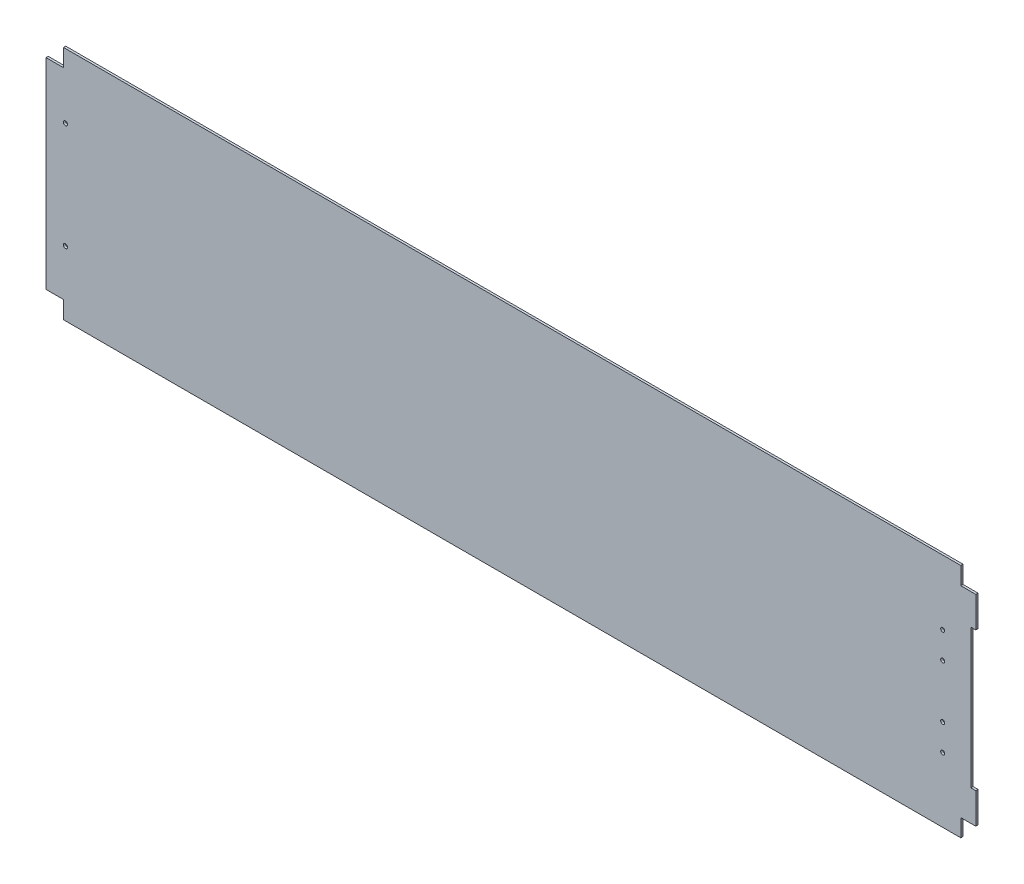
ISO-10303-21;
HEADER;
FILE_DESCRIPTION(('STEP AP214'),'2;1');
FILE_NAME('part.step','',(''),(''),'','','');
FILE_SCHEMA(('AUTOMOTIVE_DESIGN { 1 0 10303 214 1 1 1 1 }'));
ENDSEC;
DATA;
#1=APPLICATION_CONTEXT('core data for automotive mechanical design processes');
#2=APPLICATION_PROTOCOL_DEFINITION('international standard','automotive_design',2000,#1);
#3=PRODUCT_CONTEXT('',#1,'mechanical');
#4=PRODUCT('Part','Part','',(#3));
#5=PRODUCT_RELATED_PRODUCT_CATEGORY('part','',(#4));
#6=PRODUCT_DEFINITION_FORMATION('','',#4);
#7=PRODUCT_DEFINITION_CONTEXT('part definition',#1,'design');
#8=PRODUCT_DEFINITION('design','',#6,#7);
#9=PRODUCT_DEFINITION_SHAPE('','',#8);
#10=(LENGTH_UNIT() NAMED_UNIT(*) SI_UNIT(.MILLI.,.METRE.));
#11=(NAMED_UNIT(*) PLANE_ANGLE_UNIT() SI_UNIT($,.RADIAN.));
#12=(NAMED_UNIT(*) SI_UNIT($,.STERADIAN.) SOLID_ANGLE_UNIT());
#13=UNCERTAINTY_MEASURE_WITH_UNIT(LENGTH_MEASURE(1.E-05),#10,'distance_accuracy_value','');
#14=(GEOMETRIC_REPRESENTATION_CONTEXT(3) GLOBAL_UNCERTAINTY_ASSIGNED_CONTEXT((#13)) GLOBAL_UNIT_ASSIGNED_CONTEXT((#10,
#11,#12)) REPRESENTATION_CONTEXT('',''));
#15=CARTESIAN_POINT('',(0.,0.,0.));
#16=DIRECTION('',(0.,0.,1.));
#17=DIRECTION('',(1.,0.,0.));
#18=AXIS2_PLACEMENT_3D('',#15,#16,#17);
#19=CARTESIAN_POINT('',(-543.687,119.888,-54.356));
#20=DIRECTION('',(0.,-1.,0.));
#21=DIRECTION('',(0.,0.,-1.));
#22=AXIS2_PLACEMENT_3D('',#19,#20,#21);
#23=PLANE('',#22);
#24=DIRECTION('',(1.,0.,0.));
#25=VECTOR('',#24,1.);
#26=CARTESIAN_POINT('',(0.,119.888,-2.667));
#27=LINE('',#26,#25);
#28=CARTESIAN_POINT('',(-558.269184429272,119.888,-2.66699999999975));
#29=VERTEX_POINT('',#28);
#30=CARTESIAN_POINT('',(-537.337,119.888,-2.667));
#31=VERTEX_POINT('',#30);
#32=EDGE_CURVE('E441',#29,#31,#27,.T.);
#33=ORIENTED_EDGE('',*,*,#32,.F.);
#34=DIRECTION('',(0.,0.,1.));
#35=VECTOR('',#34,1.);
#36=CARTESIAN_POINT('',(-558.269184429272,119.888,2.22044604925031E-13));
#37=LINE('',#36,#35);
#38=CARTESIAN_POINT('',(-558.269184429272,119.888,1.11022302462516E-13));
#39=VERTEX_POINT('',#38);
#40=EDGE_CURVE('E284',#29,#39,#37,.T.);
#41=ORIENTED_EDGE('',*,*,#40,.T.);
#42=DIRECTION('',(1.,0.,0.));
#43=VECTOR('',#42,1.);
#44=CARTESIAN_POINT('',(-543.687,119.888,0.));
#45=LINE('',#44,#43);
#46=CARTESIAN_POINT('',(-537.337,119.888,0.));
#47=VERTEX_POINT('',#46);
#48=EDGE_CURVE('E397',#39,#47,#45,.T.);
#49=ORIENTED_EDGE('',*,*,#48,.T.);
#50=DIRECTION('',(0.,0.,1.));
#51=VECTOR('',#50,1.);
#52=CARTESIAN_POINT('',(-537.337,119.888,-54.356));
#53=LINE('',#52,#51);
#54=EDGE_CURVE('E387',#31,#47,#53,.T.);
#55=ORIENTED_EDGE('',*,*,#54,.F.);
#56=EDGE_LOOP('',(#33,#41,#49,#55));
#57=FACE_BOUND('',#56,.T.);
#58=ADVANCED_FACE('F135',(#57),#23,.F.);
#59=CARTESIAN_POINT('',(-537.337,126.238,-54.356));
#60=DIRECTION('',(1.,0.,0.));
#61=DIRECTION('',(0.,0.,-1.));
#62=AXIS2_PLACEMENT_3D('',#59,#60,#61);
#63=PLANE('',#62);
#64=DIRECTION('',(0.,1.,0.));
#65=VECTOR('',#64,1.);
#66=CARTESIAN_POINT('',(-537.337,126.238,0.));
#67=LINE('',#66,#65);
#68=CARTESIAN_POINT('',(-537.337,140.820184429272,1.11022302462516E-13));
#69=VERTEX_POINT('',#68);
#70=EDGE_CURVE('E400',#47,#69,#67,.T.);
#71=ORIENTED_EDGE('',*,*,#70,.T.);
#72=DIRECTION('',(0.,0.,-1.));
#73=VECTOR('',#72,1.);
#74=CARTESIAN_POINT('',(-537.337,140.820184429272,1.66533453693773E-13));
#75=LINE('',#74,#73);
#76=CARTESIAN_POINT('',(-537.337,140.820184429272,-2.66699999999981));
#77=VERTEX_POINT('',#76);
#78=EDGE_CURVE('E273',#69,#77,#75,.T.);
#79=ORIENTED_EDGE('',*,*,#78,.T.);
#80=DIRECTION('',(0.,1.,0.));
#81=VECTOR('',#80,1.);
#82=CARTESIAN_POINT('',(-537.337,0.,-2.667));
#83=LINE('',#82,#81);
#84=EDGE_CURVE('E151',#31,#77,#83,.T.);
#85=ORIENTED_EDGE('',*,*,#84,.F.);
#86=ORIENTED_EDGE('',*,*,#54,.T.);
#87=EDGE_LOOP('',(#71,#79,#85,#86));
#88=FACE_BOUND('',#87,.T.);
#89=ADVANCED_FACE('F489',(#88),#63,.F.);
#90=CARTESIAN_POINT('',(-537.337,-119.888,-54.356));
#91=DIRECTION('',(1.,0.,0.));
#92=DIRECTION('',(0.,0.,-1.));
#93=AXIS2_PLACEMENT_3D('',#90,#91,#92);
#94=PLANE('',#93);
#95=DIRECTION('',(0.,1.,0.));
#96=VECTOR('',#95,1.);
#97=CARTESIAN_POINT('',(-537.337,0.,-2.667));
#98=LINE('',#97,#96);
#99=CARTESIAN_POINT('',(-537.337,-140.820184429272,-2.66699999999978));
#100=VERTEX_POINT('',#99);
#101=CARTESIAN_POINT('',(-537.337,-119.888,-2.667));
#102=VERTEX_POINT('',#101);
#103=EDGE_CURVE('E435',#100,#102,#98,.T.);
#104=ORIENTED_EDGE('',*,*,#103,.F.);
#105=DIRECTION('',(0.,0.,1.));
#106=VECTOR('',#105,1.);
#107=CARTESIAN_POINT('',(-537.337,-140.820184429272,1.94289029309402E-13));
#108=LINE('',#107,#106);
#109=CARTESIAN_POINT('',(-537.337,-140.820184429272,1.66533453693773E-13));
#110=VERTEX_POINT('',#109);
#111=EDGE_CURVE('E299',#100,#110,#108,.T.);
#112=ORIENTED_EDGE('',*,*,#111,.T.);
#113=DIRECTION('',(0.,1.,0.));
#114=VECTOR('',#113,1.);
#115=CARTESIAN_POINT('',(-537.337,-119.888,0.));
#116=LINE('',#115,#114);
#117=CARTESIAN_POINT('',(-537.337,-119.888,0.));
#118=VERTEX_POINT('',#117);
#119=EDGE_CURVE('E383',#110,#118,#116,.T.);
#120=ORIENTED_EDGE('',*,*,#119,.T.);
#121=DIRECTION('',(0.,0.,1.));
#122=VECTOR('',#121,1.);
#123=CARTESIAN_POINT('',(-537.337,-119.888,-54.356));
#124=LINE('',#123,#122);
#125=EDGE_CURVE('E261',#102,#118,#124,.T.);
#126=ORIENTED_EDGE('',*,*,#125,.F.);
#127=EDGE_LOOP('',(#104,#112,#120,#126));
#128=FACE_BOUND('',#127,.T.);
#129=ADVANCED_FACE('F495',(#128),#94,.F.);
#130=CARTESIAN_POINT('',(-543.687,-119.888,-54.356));
#131=DIRECTION('',(0.,1.,0.));
#132=DIRECTION('',(0.,0.,1.));
#133=AXIS2_PLACEMENT_3D('',#130,#131,#132);
#134=PLANE('',#133);
#135=DIRECTION('',(-1.,0.,0.));
#136=VECTOR('',#135,1.);
#137=CARTESIAN_POINT('',(-543.687,-119.888,0.));
#138=LINE('',#137,#136);
#139=CARTESIAN_POINT('',(-558.269184429272,-119.888,1.11022302462516E-13));
#140=VERTEX_POINT('',#139);
#141=EDGE_CURVE('E380',#118,#140,#138,.T.);
#142=ORIENTED_EDGE('',*,*,#141,.T.);
#143=DIRECTION('',(0.,0.,-1.));
#144=VECTOR('',#143,1.);
#145=CARTESIAN_POINT('',(-558.269184429272,-119.888,2.22044604925031E-13));
#146=LINE('',#145,#144);
#147=CARTESIAN_POINT('',(-558.269184429272,-119.888,-2.66699999999975));
#148=VERTEX_POINT('',#147);
#149=EDGE_CURVE('E289',#140,#148,#146,.T.);
#150=ORIENTED_EDGE('',*,*,#149,.T.);
#151=DIRECTION('',(-1.,0.,0.));
#152=VECTOR('',#151,1.);
#153=CARTESIAN_POINT('',(0.,-119.888,-2.667));
#154=LINE('',#153,#152);
#155=EDGE_CURVE('E159',#102,#148,#154,.T.);
#156=ORIENTED_EDGE('',*,*,#155,.F.);
#157=ORIENTED_EDGE('',*,*,#125,.T.);
#158=EDGE_LOOP('',(#142,#150,#156,#157));
#159=FACE_BOUND('',#158,.T.);
#160=ADVANCED_FACE('F498',(#159),#134,.F.);
#161=CARTESIAN_POINT('',(534.035,119.888,-54.356));
#162=DIRECTION('',(0.,-1.,0.));
#163=DIRECTION('',(0.,0.,-1.));
#164=AXIS2_PLACEMENT_3D('',#161,#162,#163);
#165=PLANE('',#164);
#166=DIRECTION('',(1.,0.,0.));
#167=VECTOR('',#166,1.);
#168=CARTESIAN_POINT('',(534.035,119.888,0.));
#169=LINE('',#168,#167);
#170=CARTESIAN_POINT('',(534.035,119.888,0.));
#171=VERTEX_POINT('',#170);
#172=CARTESIAN_POINT('',(551.919184429271,119.888,2.22044604925031E-13));
#173=VERTEX_POINT('',#172);
#174=EDGE_CURVE('E256',#171,#173,#169,.T.);
#175=ORIENTED_EDGE('',*,*,#174,.T.);
#176=DIRECTION('',(0.,0.,-1.));
#177=VECTOR('',#176,1.);
#178=CARTESIAN_POINT('',(551.919184429271,119.888,-4.44089209850063E-13));
#179=LINE('',#178,#177);
#180=CARTESIAN_POINT('',(551.919184429271,119.888,-2.66700000000042));
#181=VERTEX_POINT('',#180);
#182=EDGE_CURVE('E320',#173,#181,#179,.T.);
#183=ORIENTED_EDGE('',*,*,#182,.T.);
#184=DIRECTION('',(1.,0.,0.));
#185=VECTOR('',#184,1.);
#186=CARTESIAN_POINT('',(0.,119.888,-2.667));
#187=LINE('',#186,#185);
#188=CARTESIAN_POINT('',(534.035,119.888,-2.667));
#189=VERTEX_POINT('',#188);
#190=EDGE_CURVE('E429',#189,#181,#187,.T.);
#191=ORIENTED_EDGE('',*,*,#190,.F.);
#192=DIRECTION('',(0.,0.,1.));
#193=VECTOR('',#192,1.);
#194=CARTESIAN_POINT('',(534.035,119.888,-54.356));
#195=LINE('',#194,#193);
#196=EDGE_CURVE('E377',#189,#171,#195,.T.);
#197=ORIENTED_EDGE('',*,*,#196,.T.);
#198=EDGE_LOOP('',(#175,#183,#191,#197));
#199=FACE_BOUND('',#198,.T.);
#200=ADVANCED_FACE('F502',(#199),#165,.F.);
#201=CARTESIAN_POINT('',(534.035,126.238,-54.356));
#202=DIRECTION('',(-1.,0.,0.));
#203=DIRECTION('',(0.,0.,1.));
#204=AXIS2_PLACEMENT_3D('',#201,#202,#203);
#205=PLANE('',#204);
#206=DIRECTION('',(0.,-1.,0.));
#207=VECTOR('',#206,1.);
#208=CARTESIAN_POINT('',(534.035,0.,-2.667));
#209=LINE('',#208,#207);
#210=CARTESIAN_POINT('',(534.035,140.820184429272,-2.66699999999997));
#211=VERTEX_POINT('',#210);
#212=EDGE_CURVE('E267',#211,#189,#209,.T.);
#213=ORIENTED_EDGE('',*,*,#212,.F.);
#214=DIRECTION('',(0.,0.,1.));
#215=VECTOR('',#214,1.);
#216=CARTESIAN_POINT('',(534.035,140.820184429272,0.));
#217=LINE('',#216,#215);
#218=CARTESIAN_POINT('',(534.035,140.820184429272,0.));
#219=VERTEX_POINT('',#218);
#220=EDGE_CURVE('E264',#211,#219,#217,.T.);
#221=ORIENTED_EDGE('',*,*,#220,.T.);
#222=DIRECTION('',(0.,-1.,0.));
#223=VECTOR('',#222,1.);
#224=CARTESIAN_POINT('',(534.035,126.238,0.));
#225=LINE('',#224,#223);
#226=EDGE_CURVE('E249',#219,#171,#225,.T.);
#227=ORIENTED_EDGE('',*,*,#226,.T.);
#228=ORIENTED_EDGE('',*,*,#196,.F.);
#229=EDGE_LOOP('',(#213,#221,#227,#228));
#230=FACE_BOUND('',#229,.T.);
#231=ADVANCED_FACE('F265',(#230),#205,.F.);
#232=CARTESIAN_POINT('',(534.034999999999,-119.888,-54.356));
#233=DIRECTION('',(0.,1.,0.));
#234=DIRECTION('',(0.,0.,1.));
#235=AXIS2_PLACEMENT_3D('',#232,#233,#234);
#236=PLANE('',#235);
#237=DIRECTION('',(-1.,0.,0.));
#238=VECTOR('',#237,1.);
#239=CARTESIAN_POINT('',(0.,-119.888,-2.667));
#240=LINE('',#239,#238);
#241=CARTESIAN_POINT('',(551.919184429271,-119.888,-2.66700000000042));
#242=VERTEX_POINT('',#241);
#243=CARTESIAN_POINT('',(534.034999999999,-119.888,-2.667));
#244=VERTEX_POINT('',#243);
#245=EDGE_CURVE('E425',#242,#244,#240,.T.);
#246=ORIENTED_EDGE('',*,*,#245,.F.);
#247=DIRECTION('',(0.,0.,1.));
#248=VECTOR('',#247,1.);
#249=CARTESIAN_POINT('',(551.919184429271,-119.888,-4.44089209850063E-13));
#250=LINE('',#249,#248);
#251=CARTESIAN_POINT('',(551.919184429271,-119.888,-8.88178419700125E-13));
#252=VERTEX_POINT('',#251);
#253=EDGE_CURVE('E315',#242,#252,#250,.T.);
#254=ORIENTED_EDGE('',*,*,#253,.T.);
#255=DIRECTION('',(-1.,0.,0.));
#256=VECTOR('',#255,1.);
#257=CARTESIAN_POINT('',(534.034999999999,-119.888,0.));
#258=LINE('',#257,#256);
#259=CARTESIAN_POINT('',(534.034999999999,-119.888,0.));
#260=VERTEX_POINT('',#259);
#261=EDGE_CURVE('E370',#252,#260,#258,.T.);
#262=ORIENTED_EDGE('',*,*,#261,.T.);
#263=DIRECTION('',(0.,0.,1.));
#264=VECTOR('',#263,1.);
#265=CARTESIAN_POINT('',(534.034999999999,-119.888,-54.356));
#266=LINE('',#265,#264);
#267=EDGE_CURVE('E319',#244,#260,#266,.T.);
#268=ORIENTED_EDGE('',*,*,#267,.F.);
#269=EDGE_LOOP('',(#246,#254,#262,#268));
#270=FACE_BOUND('',#269,.T.);
#271=ADVANCED_FACE('F501',(#270),#236,.F.);
#272=CARTESIAN_POINT('',(534.034999999999,-119.888,-54.356));
#273=DIRECTION('',(-1.,0.,0.));
#274=DIRECTION('',(0.,0.,1.));
#275=AXIS2_PLACEMENT_3D('',#272,#273,#274);
#276=PLANE('',#275);
#277=DIRECTION('',(0.,-1.,0.));
#278=VECTOR('',#277,1.);
#279=CARTESIAN_POINT('',(534.034999999999,-119.888,0.));
#280=LINE('',#279,#278);
#281=CARTESIAN_POINT('',(534.034999999999,-140.820184429272,0.));
#282=VERTEX_POINT('',#281);
#283=EDGE_CURVE('E374',#260,#282,#280,.T.);
#284=ORIENTED_EDGE('',*,*,#283,.T.);
#285=DIRECTION('',(0.,0.,-1.));
#286=VECTOR('',#285,1.);
#287=CARTESIAN_POINT('',(534.034999999999,-140.820184429272,0.));
#288=LINE('',#287,#286);
#289=CARTESIAN_POINT('',(534.034999999999,-140.820184429272,-2.66699999999995));
#290=VERTEX_POINT('',#289);
#291=EDGE_CURVE('E304',#282,#290,#288,.T.);
#292=ORIENTED_EDGE('',*,*,#291,.T.);
#293=DIRECTION('',(0.,-1.,0.));
#294=VECTOR('',#293,1.);
#295=CARTESIAN_POINT('',(534.034999999999,0.,-2.667));
#296=LINE('',#295,#294);
#297=EDGE_CURVE('E432',#244,#290,#296,.T.);
#298=ORIENTED_EDGE('',*,*,#297,.F.);
#299=ORIENTED_EDGE('',*,*,#267,.T.);
#300=EDGE_LOOP('',(#284,#292,#298,#299));
#301=FACE_BOUND('',#300,.T.);
#302=ADVANCED_FACE('F507',(#301),#276,.F.);
#303=CARTESIAN_POINT('',(0.,0.,-2.667));
#304=DIRECTION('',(0.,0.,1.));
#305=DIRECTION('',(1.,0.,0.));
#306=AXIS2_PLACEMENT_3D('',#303,#304,#305);
#307=PLANE('',#306);
#308=CARTESIAN_POINT('',(512.445,-31.75,-2.667));
#309=DIRECTION('',(0.,0.,1.));
#310=DIRECTION('',(1.,0.,0.));
#311=AXIS2_PLACEMENT_3D('',#308,#309,#310);
#312=CIRCLE('',#311,2.413);
#313=CARTESIAN_POINT('',(514.858,-31.75,-2.667));
#314=VERTEX_POINT('',#313);
#315=EDGE_CURVE('E13',#314,#314,#312,.T.);
#316=ORIENTED_EDGE('',*,*,#315,.T.);
#317=EDGE_LOOP('',(#316));
#318=FACE_BOUND('',#317,.T.);
#319=CARTESIAN_POINT('',(-535.051,-63.5,-2.667));
#320=DIRECTION('',(0.,0.,1.));
#321=DIRECTION('',(1.,0.,0.));
#322=AXIS2_PLACEMENT_3D('',#319,#320,#321);
#323=CIRCLE('',#322,2.53999999999995);
#324=CARTESIAN_POINT('',(-532.511,-63.5,-2.667));
#325=VERTEX_POINT('',#324);
#326=EDGE_CURVE('E144',#325,#325,#323,.T.);
#327=ORIENTED_EDGE('',*,*,#326,.T.);
#328=EDGE_LOOP('',(#327));
#329=FACE_BOUND('',#328,.T.);
#330=CARTESIAN_POINT('',(512.445,63.5,-2.667));
#331=DIRECTION('',(0.,0.,1.));
#332=DIRECTION('',(1.,0.,0.));
#333=AXIS2_PLACEMENT_3D('',#330,#331,#332);
#334=CIRCLE('',#333,2.41299999999999);
#335=CARTESIAN_POINT('',(514.858,63.5,-2.667));
#336=VERTEX_POINT('',#335);
#337=EDGE_CURVE('E461',#336,#336,#334,.T.);
#338=ORIENTED_EDGE('',*,*,#337,.T.);
#339=EDGE_LOOP('',(#338));
#340=FACE_BOUND('',#339,.T.);
#341=CARTESIAN_POINT('',(512.445,31.75,-2.667));
#342=DIRECTION('',(0.,0.,1.));
#343=DIRECTION('',(1.,0.,0.));
#344=AXIS2_PLACEMENT_3D('',#341,#342,#343);
#345=CIRCLE('',#344,2.41299999999999);
#346=CARTESIAN_POINT('',(514.858,31.75,-2.667));
#347=VERTEX_POINT('',#346);
#348=EDGE_CURVE('E457',#347,#347,#345,.T.);
#349=ORIENTED_EDGE('',*,*,#348,.T.);
#350=EDGE_LOOP('',(#349));
#351=FACE_BOUND('',#350,.T.);
#352=CARTESIAN_POINT('',(512.445,-63.5,-2.667));
#353=DIRECTION('',(0.,0.,1.));
#354=DIRECTION('',(1.,0.,0.));
#355=AXIS2_PLACEMENT_3D('',#352,#353,#354);
#356=CIRCLE('',#355,2.41299999999999);
#357=CARTESIAN_POINT('',(514.858,-63.5,-2.667));
#358=VERTEX_POINT('',#357);
#359=EDGE_CURVE('E453',#358,#358,#356,.T.);
#360=ORIENTED_EDGE('',*,*,#359,.T.);
#361=EDGE_LOOP('',(#360));
#362=FACE_BOUND('',#361,.T.);
#363=CARTESIAN_POINT('',(-535.051,63.5,-2.667));
#364=DIRECTION('',(0.,0.,1.));
#365=DIRECTION('',(1.,0.,0.));
#366=AXIS2_PLACEMENT_3D('',#363,#364,#365);
#367=CIRCLE('',#366,2.53999999999995);
#368=CARTESIAN_POINT('',(-532.511,63.5,-2.667));
#369=VERTEX_POINT('',#368);
#370=EDGE_CURVE('E449',#369,#369,#367,.T.);
#371=ORIENTED_EDGE('',*,*,#370,.T.);
#372=EDGE_LOOP('',(#371));
#373=FACE_BOUND('',#372,.T.);
#374=ORIENTED_EDGE('',*,*,#32,.T.);
#375=ORIENTED_EDGE('',*,*,#84,.T.);
#376=DIRECTION('',(-1.,0.,0.));
#377=VECTOR('',#376,1.);
#378=CARTESIAN_POINT('',(0.,140.820184429272,-2.66699999999989));
#379=LINE('',#378,#377);
#380=EDGE_CURVE('E278',#77,#211,#379,.F.);
#381=ORIENTED_EDGE('',*,*,#380,.T.);
#382=ORIENTED_EDGE('',*,*,#212,.T.);
#383=ORIENTED_EDGE('',*,*,#190,.T.);
#384=DIRECTION('',(0.,1.,0.));
#385=VECTOR('',#384,1.);
#386=CARTESIAN_POINT('',(551.919184429271,-1.47725552612216E-12,-2.66700000000009));
#387=LINE('',#386,#385);
#388=CARTESIAN_POINT('',(551.919184429271,83.058,-2.66699999999986));
#389=VERTEX_POINT('',#388);
#390=EDGE_CURVE('E328',#181,#389,#387,.F.);
#391=ORIENTED_EDGE('',*,*,#390,.T.);
#392=DIRECTION('',(-1.,0.,0.));
#393=VECTOR('',#392,1.);
#394=CARTESIAN_POINT('',(539.219184429271,83.058,-2.66699999999986));
#395=LINE('',#394,#393);
#396=CARTESIAN_POINT('',(546.077184429271,83.058,-2.66699999999986));
#397=VERTEX_POINT('',#396);
#398=EDGE_CURVE('E324',#389,#397,#395,.T.);
#399=ORIENTED_EDGE('',*,*,#398,.T.);
#400=DIRECTION('',(0.,-1.,0.));
#401=VECTOR('',#400,1.);
#402=CARTESIAN_POINT('',(546.077184429271,-1.47652665071209E-12,-2.66700000000009));
#403=LINE('',#402,#401);
#404=CARTESIAN_POINT('',(546.077184429271,-83.058,-2.66700000000009));
#405=VERTEX_POINT('',#404);
#406=EDGE_CURVE('E337',#397,#405,#403,.T.);
#407=ORIENTED_EDGE('',*,*,#406,.T.);
#408=DIRECTION('',(1.,0.,0.));
#409=VECTOR('',#408,1.);
#410=CARTESIAN_POINT('',(539.219184429271,-83.058,-2.66700000000031));
#411=LINE('',#410,#409);
#412=CARTESIAN_POINT('',(551.919184429271,-83.058,-2.66700000000042));
#413=VERTEX_POINT('',#412);
#414=EDGE_CURVE('E333',#405,#413,#411,.T.);
#415=ORIENTED_EDGE('',*,*,#414,.T.);
#416=EDGE_CURVE('E332',#413,#242,#387,.F.);
#417=ORIENTED_EDGE('',*,*,#416,.T.);
#418=ORIENTED_EDGE('',*,*,#245,.T.);
#419=ORIENTED_EDGE('',*,*,#297,.T.);
#420=DIRECTION('',(-1.,0.,0.));
#421=VECTOR('',#420,1.);
#422=CARTESIAN_POINT('',(0.,-140.820184429272,-2.66699999999986));
#423=LINE('',#422,#421);
#424=EDGE_CURVE('E308',#290,#100,#423,.T.);
#425=ORIENTED_EDGE('',*,*,#424,.T.);
#426=ORIENTED_EDGE('',*,*,#103,.T.);
#427=ORIENTED_EDGE('',*,*,#155,.T.);
#428=DIRECTION('',(0.,1.,0.));
#429=VECTOR('',#428,1.);
#430=CARTESIAN_POINT('',(-558.269184429272,0.,-2.66699999999975));
#431=LINE('',#430,#429);
#432=EDGE_CURVE('E292',#148,#29,#431,.T.);
#433=ORIENTED_EDGE('',*,*,#432,.T.);
#434=EDGE_LOOP('',(#374,#375,#381,#382,#383,#391,#399,#407,#415,#417,#418,#419,#425,#426,#427,#433));
#435=FACE_BOUND('',#434,.T.);
#436=ADVANCED_FACE('F468',(#318,#329,#340,#351,#362,#373,#435),#307,.F.);
#437=CARTESIAN_POINT('',(0.,0.,0.));
#438=DIRECTION('',(0.,0.,1.));
#439=DIRECTION('',(1.,0.,0.));
#440=AXIS2_PLACEMENT_3D('',#437,#438,#439);
#441=PLANE('',#440);
#442=CARTESIAN_POINT('',(512.445,-31.75,0.));
#443=DIRECTION('',(0.,0.,1.));
#444=DIRECTION('',(1.,0.,0.));
#445=AXIS2_PLACEMENT_3D('',#442,#443,#444);
#446=CIRCLE('',#445,2.413);
#447=CARTESIAN_POINT('',(514.858,-31.75,0.));
#448=VERTEX_POINT('',#447);
#449=EDGE_CURVE('E392',#448,#448,#446,.T.);
#450=ORIENTED_EDGE('',*,*,#449,.F.);
#451=EDGE_LOOP('',(#450));
#452=FACE_BOUND('',#451,.T.);
#453=ORIENTED_EDGE('',*,*,#70,.F.);
#454=ORIENTED_EDGE('',*,*,#48,.F.);
#455=DIRECTION('',(0.,-1.,0.));
#456=VECTOR('',#455,1.);
#457=CARTESIAN_POINT('',(-558.269184429272,-126.238,2.22044604925031E-13));
#458=LINE('',#457,#456);
#459=EDGE_CURVE('E272',#140,#39,#458,.F.);
#460=ORIENTED_EDGE('',*,*,#459,.F.);
#461=ORIENTED_EDGE('',*,*,#141,.F.);
#462=ORIENTED_EDGE('',*,*,#119,.F.);
#463=DIRECTION('',(1.,0.,0.));
#464=VECTOR('',#463,1.);
#465=CARTESIAN_POINT('',(543.687,-140.820184429272,0.));
#466=LINE('',#465,#464);
#467=EDGE_CURVE('E288',#282,#110,#466,.F.);
#468=ORIENTED_EDGE('',*,*,#467,.F.);
#469=ORIENTED_EDGE('',*,*,#283,.F.);
#470=ORIENTED_EDGE('',*,*,#261,.F.);
#471=DIRECTION('',(0.,-1.,0.));
#472=VECTOR('',#471,1.);
#473=CARTESIAN_POINT('',(551.919184429271,-120.904,-4.44089209850063E-13));
#474=LINE('',#473,#472);
#475=CARTESIAN_POINT('',(551.919184429271,-83.058,-3.33066907387547E-13));
#476=VERTEX_POINT('',#475);
#477=EDGE_CURVE('E357',#476,#252,#474,.T.);
#478=ORIENTED_EDGE('',*,*,#477,.F.);
#479=DIRECTION('',(1.,0.,0.));
#480=VECTOR('',#479,1.);
#481=CARTESIAN_POINT('',(551.919184429271,-83.058,-3.33066907387547E-13));
#482=LINE('',#481,#480);
#483=CARTESIAN_POINT('',(546.077184429271,-83.058,-3.33066907387547E-13));
#484=VERTEX_POINT('',#483);
#485=EDGE_CURVE('E351',#484,#476,#482,.T.);
#486=ORIENTED_EDGE('',*,*,#485,.F.);
#487=DIRECTION('',(0.,-1.,0.));
#488=VECTOR('',#487,1.);
#489=CARTESIAN_POINT('',(546.077184429271,-83.058,-3.33066907387547E-13));
#490=LINE('',#489,#488);
#491=CARTESIAN_POINT('',(546.077184429271,83.058,1.11022302462516E-13));
#492=VERTEX_POINT('',#491);
#493=EDGE_CURVE('E341',#492,#484,#490,.T.);
#494=ORIENTED_EDGE('',*,*,#493,.F.);
#495=DIRECTION('',(-1.,0.,0.));
#496=VECTOR('',#495,1.);
#497=CARTESIAN_POINT('',(551.919184429271,83.058,1.11022302462516E-13));
#498=LINE('',#497,#496);
#499=CARTESIAN_POINT('',(551.919184429271,83.058,1.11022302462516E-13));
#500=VERTEX_POINT('',#499);
#501=EDGE_CURVE('E362',#500,#492,#498,.T.);
#502=ORIENTED_EDGE('',*,*,#501,.F.);
#503=EDGE_CURVE('E358',#173,#500,#474,.T.);
#504=ORIENTED_EDGE('',*,*,#503,.F.);
#505=ORIENTED_EDGE('',*,*,#174,.F.);
#506=ORIENTED_EDGE('',*,*,#226,.F.);
#507=DIRECTION('',(1.,0.,0.));
#508=VECTOR('',#507,1.);
#509=CARTESIAN_POINT('',(543.687,140.820184429272,0.));
#510=LINE('',#509,#508);
#511=EDGE_CURVE('E254',#69,#219,#510,.T.);
#512=ORIENTED_EDGE('',*,*,#511,.F.);
#513=EDGE_LOOP('',(#453,#454,#460,#461,#462,#468,#469,#470,#478,#486,#494,#502,#504,#505,#506,#512));
#514=FACE_BOUND('',#513,.T.);
#515=CARTESIAN_POINT('',(-535.051,-63.5,0.));
#516=DIRECTION('',(0.,0.,1.));
#517=DIRECTION('',(1.,0.,0.));
#518=AXIS2_PLACEMENT_3D('',#515,#516,#517);
#519=CIRCLE('',#518,2.53999999999995);
#520=CARTESIAN_POINT('',(-532.511,-63.5,0.));
#521=VERTEX_POINT('',#520);
#522=EDGE_CURVE('E414',#521,#521,#519,.T.);
#523=ORIENTED_EDGE('',*,*,#522,.F.);
#524=EDGE_LOOP('',(#523));
#525=FACE_BOUND('',#524,.T.);
#526=CARTESIAN_POINT('',(512.445,63.5,0.));
#527=DIRECTION('',(0.,0.,1.));
#528=DIRECTION('',(1.,0.,0.));
#529=AXIS2_PLACEMENT_3D('',#526,#527,#528);
#530=CIRCLE('',#529,2.41299999999999);
#531=CARTESIAN_POINT('',(514.858,63.5,0.));
#532=VERTEX_POINT('',#531);
#533=EDGE_CURVE('E410',#532,#532,#530,.T.);
#534=ORIENTED_EDGE('',*,*,#533,.F.);
#535=EDGE_LOOP('',(#534));
#536=FACE_BOUND('',#535,.T.);
#537=CARTESIAN_POINT('',(512.445,31.75,0.));
#538=DIRECTION('',(0.,0.,1.));
#539=DIRECTION('',(1.,0.,0.));
#540=AXIS2_PLACEMENT_3D('',#537,#538,#539);
#541=CIRCLE('',#540,2.41299999999999);
#542=CARTESIAN_POINT('',(514.858,31.75,0.));
#543=VERTEX_POINT('',#542);
#544=EDGE_CURVE('E406',#543,#543,#541,.T.);
#545=ORIENTED_EDGE('',*,*,#544,.F.);
#546=EDGE_LOOP('',(#545));
#547=FACE_BOUND('',#546,.T.);
#548=CARTESIAN_POINT('',(512.445,-63.5,0.));
#549=DIRECTION('',(0.,0.,1.));
#550=DIRECTION('',(1.,0.,0.));
#551=AXIS2_PLACEMENT_3D('',#548,#549,#550);
#552=CIRCLE('',#551,2.41299999999999);
#553=CARTESIAN_POINT('',(514.858,-63.5,0.));
#554=VERTEX_POINT('',#553);
#555=EDGE_CURVE('E396',#554,#554,#552,.T.);
#556=ORIENTED_EDGE('',*,*,#555,.F.);
#557=EDGE_LOOP('',(#556));
#558=FACE_BOUND('',#557,.T.);
#559=CARTESIAN_POINT('',(-535.051,63.5,0.));
#560=DIRECTION('',(0.,0.,1.));
#561=DIRECTION('',(1.,0.,0.));
#562=AXIS2_PLACEMENT_3D('',#559,#560,#561);
#563=CIRCLE('',#562,2.53999999999995);
#564=CARTESIAN_POINT('',(-532.511,63.5,0.));
#565=VERTEX_POINT('',#564);
#566=EDGE_CURVE('E418',#565,#565,#563,.T.);
#567=ORIENTED_EDGE('',*,*,#566,.F.);
#568=EDGE_LOOP('',(#567));
#569=FACE_BOUND('',#568,.T.);
#570=ADVANCED_FACE('F137',(#452,#514,#525,#536,#547,#558,#569),#441,.T.);
#571=CARTESIAN_POINT('',(-535.051,63.5,-54.356));
#572=DIRECTION('',(0.,0.,1.));
#573=DIRECTION('',(1.,0.,0.));
#574=AXIS2_PLACEMENT_3D('',#571,#572,#573);
#575=CYLINDRICAL_SURFACE('',#574,2.53999999999995);
#576=ORIENTED_EDGE('',*,*,#566,.T.);
#577=EDGE_LOOP('',(#576));
#578=FACE_BOUND('',#577,.T.);
#579=ORIENTED_EDGE('',*,*,#370,.F.);
#580=EDGE_LOOP('',(#579));
#581=FACE_BOUND('',#580,.T.);
#582=ADVANCED_FACE('F580',(#578,#581),#575,.F.);
#583=CARTESIAN_POINT('',(512.445,-63.5,-54.356));
#584=DIRECTION('',(0.,0.,1.));
#585=DIRECTION('',(1.,0.,0.));
#586=AXIS2_PLACEMENT_3D('',#583,#584,#585);
#587=CYLINDRICAL_SURFACE('',#586,2.41299999999999);
#588=ORIENTED_EDGE('',*,*,#555,.T.);
#589=EDGE_LOOP('',(#588));
#590=FACE_BOUND('',#589,.T.);
#591=ORIENTED_EDGE('',*,*,#359,.F.);
#592=EDGE_LOOP('',(#591));
#593=FACE_BOUND('',#592,.T.);
#594=ADVANCED_FACE('F577',(#590,#593),#587,.F.);
#595=CARTESIAN_POINT('',(512.445,31.75,-54.356));
#596=DIRECTION('',(0.,0.,1.));
#597=DIRECTION('',(1.,0.,0.));
#598=AXIS2_PLACEMENT_3D('',#595,#596,#597);
#599=CYLINDRICAL_SURFACE('',#598,2.41299999999999);
#600=ORIENTED_EDGE('',*,*,#544,.T.);
#601=EDGE_LOOP('',(#600));
#602=FACE_BOUND('',#601,.T.);
#603=ORIENTED_EDGE('',*,*,#348,.F.);
#604=EDGE_LOOP('',(#603));
#605=FACE_BOUND('',#604,.T.);
#606=ADVANCED_FACE('F484',(#602,#605),#599,.F.);
#607=CARTESIAN_POINT('',(512.445,63.5,-54.356));
#608=DIRECTION('',(0.,0.,1.));
#609=DIRECTION('',(1.,0.,0.));
#610=AXIS2_PLACEMENT_3D('',#607,#608,#609);
#611=CYLINDRICAL_SURFACE('',#610,2.41299999999999);
#612=ORIENTED_EDGE('',*,*,#533,.T.);
#613=EDGE_LOOP('',(#612));
#614=FACE_BOUND('',#613,.T.);
#615=ORIENTED_EDGE('',*,*,#337,.F.);
#616=EDGE_LOOP('',(#615));
#617=FACE_BOUND('',#616,.T.);
#618=ADVANCED_FACE('F474',(#614,#617),#611,.F.);
#619=CARTESIAN_POINT('',(-535.051,-63.5,-54.356));
#620=DIRECTION('',(0.,0.,1.));
#621=DIRECTION('',(1.,0.,0.));
#622=AXIS2_PLACEMENT_3D('',#619,#620,#621);
#623=CYLINDRICAL_SURFACE('',#622,2.53999999999995);
#624=ORIENTED_EDGE('',*,*,#522,.T.);
#625=EDGE_LOOP('',(#624));
#626=FACE_BOUND('',#625,.T.);
#627=ORIENTED_EDGE('',*,*,#326,.F.);
#628=EDGE_LOOP('',(#627));
#629=FACE_BOUND('',#628,.T.);
#630=ADVANCED_FACE('F471',(#626,#629),#623,.F.);
#631=CARTESIAN_POINT('',(512.445,-31.75,-54.356));
#632=DIRECTION('',(0.,0.,1.));
#633=DIRECTION('',(1.,0.,0.));
#634=AXIS2_PLACEMENT_3D('',#631,#632,#633);
#635=CYLINDRICAL_SURFACE('',#634,2.413);
#636=ORIENTED_EDGE('',*,*,#449,.T.);
#637=EDGE_LOOP('',(#636));
#638=FACE_BOUND('',#637,.T.);
#639=ORIENTED_EDGE('',*,*,#315,.F.);
#640=EDGE_LOOP('',(#639));
#641=FACE_BOUND('',#640,.T.);
#642=ADVANCED_FACE('F473',(#638,#641),#635,.F.);
#643=CARTESIAN_POINT('',(551.919184429271,83.0580000000001,-54.3559999999999));
#644=DIRECTION('',(0.,1.,0.));
#645=DIRECTION('',(0.,0.,-1.));
#646=AXIS2_PLACEMENT_3D('',#643,#644,#645);
#647=PLANE('',#646);
#648=DIRECTION('',(0.,0.,1.));
#649=VECTOR('',#648,1.);
#650=CARTESIAN_POINT('',(551.919184429271,83.058,1.11022302462516E-13));
#651=LINE('',#650,#649);
#652=EDGE_CURVE('E303',#389,#500,#651,.T.);
#653=ORIENTED_EDGE('',*,*,#652,.T.);
#654=ORIENTED_EDGE('',*,*,#501,.T.);
#655=DIRECTION('',(0.,0.,1.));
#656=VECTOR('',#655,1.);
#657=CARTESIAN_POINT('',(546.077184429271,83.0580000000001,-54.3559999999999));
#658=LINE('',#657,#656);
#659=EDGE_CURVE('E345',#397,#492,#658,.T.);
#660=ORIENTED_EDGE('',*,*,#659,.F.);
#661=ORIENTED_EDGE('',*,*,#398,.F.);
#662=EDGE_LOOP('',(#653,#654,#660,#661));
#663=FACE_BOUND('',#662,.T.);
#664=ADVANCED_FACE('F481',(#663),#647,.F.);
#665=CARTESIAN_POINT('',(551.919184429271,-120.904,-4.44089209850063E-13));
#666=DIRECTION('',(1.,0.,0.));
#667=DIRECTION('',(0.,0.,-1.));
#668=AXIS2_PLACEMENT_3D('',#665,#666,#667);
#669=PLANE('',#668);
#670=ORIENTED_EDGE('',*,*,#652,.F.);
#671=ORIENTED_EDGE('',*,*,#390,.F.);
#672=ORIENTED_EDGE('',*,*,#182,.F.);
#673=ORIENTED_EDGE('',*,*,#503,.T.);
#674=EDGE_LOOP('',(#670,#671,#672,#673));
#675=FACE_BOUND('',#674,.T.);
#676=ADVANCED_FACE('F546',(#675),#669,.T.);
#677=DIRECTION('',(0.,0.,-1.));
#678=VECTOR('',#677,1.);
#679=CARTESIAN_POINT('',(551.919184429271,-83.058,-3.33066907387547E-13));
#680=LINE('',#679,#678);
#681=EDGE_CURVE('E348',#476,#413,#680,.T.);
#682=ORIENTED_EDGE('',*,*,#681,.F.);
#683=ORIENTED_EDGE('',*,*,#477,.T.);
#684=ORIENTED_EDGE('',*,*,#253,.F.);
#685=ORIENTED_EDGE('',*,*,#416,.F.);
#686=EDGE_LOOP('',(#682,#683,#684,#685));
#687=FACE_BOUND('',#686,.T.);
#688=ADVANCED_FACE('F561',(#687),#669,.T.);
#689=CARTESIAN_POINT('',(551.919184429271,-83.0579999999999,-54.3560000000003));
#690=DIRECTION('',(0.,-1.,0.));
#691=DIRECTION('',(0.,0.,1.));
#692=AXIS2_PLACEMENT_3D('',#689,#690,#691);
#693=PLANE('',#692);
#694=DIRECTION('',(0.,0.,1.));
#695=VECTOR('',#694,1.);
#696=CARTESIAN_POINT('',(546.077184429271,-83.0579999999999,-54.3560000000003));
#697=LINE('',#696,#695);
#698=EDGE_CURVE('E354',#405,#484,#697,.T.);
#699=ORIENTED_EDGE('',*,*,#698,.T.);
#700=ORIENTED_EDGE('',*,*,#485,.T.);
#701=ORIENTED_EDGE('',*,*,#681,.T.);
#702=ORIENTED_EDGE('',*,*,#414,.F.);
#703=EDGE_LOOP('',(#699,#700,#701,#702));
#704=FACE_BOUND('',#703,.T.);
#705=ADVANCED_FACE('F565',(#704),#693,.F.);
#706=CARTESIAN_POINT('',(546.077184429271,-83.0579999999999,-54.3560000000003));
#707=DIRECTION('',(-1.,0.,0.));
#708=DIRECTION('',(0.,0.,1.));
#709=AXIS2_PLACEMENT_3D('',#706,#707,#708);
#710=PLANE('',#709);
#711=ORIENTED_EDGE('',*,*,#659,.T.);
#712=ORIENTED_EDGE('',*,*,#493,.T.);
#713=ORIENTED_EDGE('',*,*,#698,.F.);
#714=ORIENTED_EDGE('',*,*,#406,.F.);
#715=EDGE_LOOP('',(#711,#712,#713,#714));
#716=FACE_BOUND('',#715,.T.);
#717=ADVANCED_FACE('F555',(#716),#710,.F.);
#718=CARTESIAN_POINT('',(543.687,-140.820184429272,0.));
#719=DIRECTION('',(0.,-1.,0.));
#720=DIRECTION('',(0.,0.,-1.));
#721=AXIS2_PLACEMENT_3D('',#718,#719,#720);
#722=PLANE('',#721);
#723=ORIENTED_EDGE('',*,*,#111,.F.);
#724=ORIENTED_EDGE('',*,*,#424,.F.);
#725=ORIENTED_EDGE('',*,*,#291,.F.);
#726=ORIENTED_EDGE('',*,*,#467,.T.);
#727=EDGE_LOOP('',(#723,#724,#725,#726));
#728=FACE_BOUND('',#727,.T.);
#729=ADVANCED_FACE('F528',(#728),#722,.T.);
#730=CARTESIAN_POINT('',(-558.269184429272,-126.238,2.22044604925031E-13));
#731=DIRECTION('',(-1.,0.,0.));
#732=DIRECTION('',(0.,0.,1.));
#733=AXIS2_PLACEMENT_3D('',#730,#731,#732);
#734=PLANE('',#733);
#735=ORIENTED_EDGE('',*,*,#40,.F.);
#736=ORIENTED_EDGE('',*,*,#432,.F.);
#737=ORIENTED_EDGE('',*,*,#149,.F.);
#738=ORIENTED_EDGE('',*,*,#459,.T.);
#739=EDGE_LOOP('',(#735,#736,#737,#738));
#740=FACE_BOUND('',#739,.T.);
#741=ADVANCED_FACE('F540',(#740),#734,.T.);
#742=CARTESIAN_POINT('',(543.687,140.820184429272,0.));
#743=DIRECTION('',(0.,1.,0.));
#744=DIRECTION('',(0.,0.,1.));
#745=AXIS2_PLACEMENT_3D('',#742,#743,#744);
#746=PLANE('',#745);
#747=ORIENTED_EDGE('',*,*,#78,.F.);
#748=ORIENTED_EDGE('',*,*,#511,.T.);
#749=ORIENTED_EDGE('',*,*,#220,.F.);
#750=ORIENTED_EDGE('',*,*,#380,.F.);
#751=EDGE_LOOP('',(#747,#748,#749,#750));
#752=FACE_BOUND('',#751,.T.);
#753=ADVANCED_FACE('F276',(#752),#746,.T.);
#754=CLOSED_SHELL('',(#58,#89,#129,#160,#200,#231,#271,#302,#436,#570,#582,#594,#606,#618,#630,
#642,#664,#676,#688,#705,#717,#729,#741,#753));
#755=MANIFOLD_SOLID_BREP('B2',#754);
#756=ADVANCED_BREP_SHAPE_REPRESENTATION('',(#18,#755),#14);
#757=SHAPE_DEFINITION_REPRESENTATION(#9,#756);
ENDSEC;
END-ISO-10303-21;
